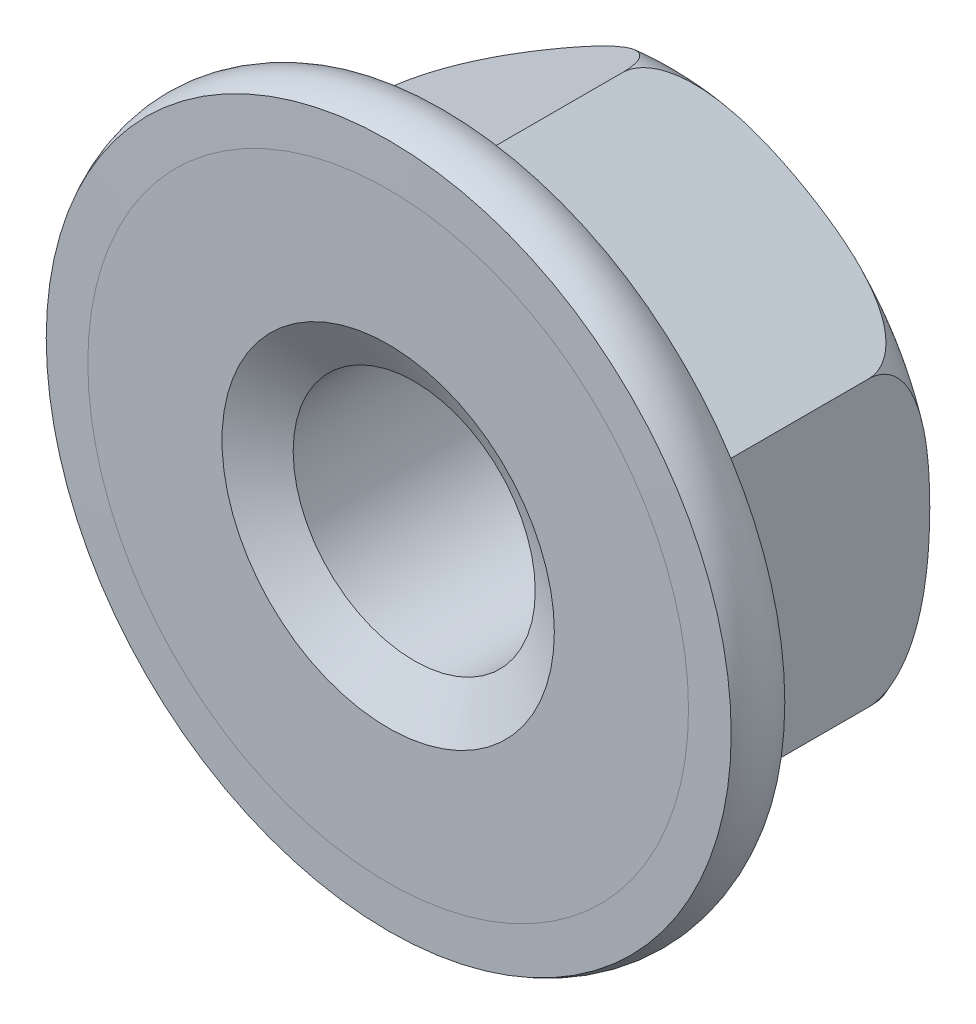
ISO-10303-21;
HEADER;
FILE_DESCRIPTION(('STEP AP214'),'2;1');
FILE_NAME('part.step','',(''),(''),'','','');
FILE_SCHEMA(('AUTOMOTIVE_DESIGN { 1 0 10303 214 1 1 1 1 }'));
ENDSEC;
DATA;
#1=APPLICATION_CONTEXT('core data for automotive mechanical design processes');
#2=APPLICATION_PROTOCOL_DEFINITION('international standard','automotive_design',2000,#1);
#3=PRODUCT_CONTEXT('',#1,'mechanical');
#4=PRODUCT('Part','Part','',(#3));
#5=PRODUCT_RELATED_PRODUCT_CATEGORY('part','',(#4));
#6=PRODUCT_DEFINITION_FORMATION('','',#4);
#7=PRODUCT_DEFINITION_CONTEXT('part definition',#1,'design');
#8=PRODUCT_DEFINITION('design','',#6,#7);
#9=PRODUCT_DEFINITION_SHAPE('','',#8);
#10=(LENGTH_UNIT() NAMED_UNIT(*) SI_UNIT(.MILLI.,.METRE.));
#11=(NAMED_UNIT(*) PLANE_ANGLE_UNIT() SI_UNIT($,.RADIAN.));
#12=(NAMED_UNIT(*) SI_UNIT($,.STERADIAN.) SOLID_ANGLE_UNIT());
#13=UNCERTAINTY_MEASURE_WITH_UNIT(LENGTH_MEASURE(1.E-05),#10,'distance_accuracy_value','');
#14=(GEOMETRIC_REPRESENTATION_CONTEXT(3) GLOBAL_UNCERTAINTY_ASSIGNED_CONTEXT((#13)) GLOBAL_UNIT_ASSIGNED_CONTEXT((#10,
#11,#12)) REPRESENTATION_CONTEXT('',''));
#15=CARTESIAN_POINT('',(0.,0.,0.));
#16=DIRECTION('',(0.,0.,1.));
#17=DIRECTION('',(1.,0.,0.));
#18=AXIS2_PLACEMENT_3D('',#15,#16,#17);
#19=CARTESIAN_POINT('',(0.,0.,-6.));
#20=DIRECTION('',(0.,0.,-1.));
#21=DIRECTION('',(-1.,0.,0.));
#22=AXIS2_PLACEMENT_3D('',#19,#20,#21);
#23=CONICAL_SURFACE('',#22,3.,1.0471975511966);
#24=CARTESIAN_POINT('',(0.,0.,-5.68736482923382));
#25=DIRECTION('',(0.,0.,1.));
#26=DIRECTION('',(1.,0.,0.));
#27=AXIS2_PLACEMENT_3D('',#24,#25,#26);
#28=CIRCLE('',#27,2.4585);
#29=CARTESIAN_POINT('',(2.4585,0.,-5.68736482923382));
#30=VERTEX_POINT('',#29);
#31=EDGE_CURVE('E29',#30,#30,#28,.T.);
#32=ORIENTED_EDGE('',*,*,#31,.T.);
#33=EDGE_LOOP('',(#32));
#34=FACE_BOUND('',#33,.T.);
#35=CARTESIAN_POINT('',(0.,0.,-6.));
#36=DIRECTION('',(0.,0.,1.));
#37=DIRECTION('',(1.,0.,0.));
#38=AXIS2_PLACEMENT_3D('',#35,#36,#37);
#39=CIRCLE('',#38,3.);
#40=CARTESIAN_POINT('',(3.,0.,-6.));
#41=VERTEX_POINT('',#40);
#42=EDGE_CURVE('E10',#41,#41,#39,.T.);
#43=ORIENTED_EDGE('',*,*,#42,.F.);
#44=EDGE_LOOP('',(#43));
#45=FACE_BOUND('',#44,.T.);
#46=ADVANCED_FACE('F16',(#34,#45),#23,.F.);
#47=CARTESIAN_POINT('',(0.,0.,-6.));
#48=DIRECTION('',(0.,0.,-1.));
#49=DIRECTION('',(0.,-1.,0.));
#50=AXIS2_PLACEMENT_3D('',#47,#48,#49);
#51=PLANE('',#50);
#52=ORIENTED_EDGE('',*,*,#42,.T.);
#53=EDGE_LOOP('',(#52));
#54=FACE_BOUND('',#53,.T.);
#55=CARTESIAN_POINT('',(0.,0.,-6.));
#56=DIRECTION('',(0.,0.,-1.));
#57=DIRECTION('',(-1.,0.,0.));
#58=AXIS2_PLACEMENT_3D('',#55,#56,#57);
#59=CIRCLE('',#58,5.);
#60=CARTESIAN_POINT('',(-2.5,-4.3301270189222,-6.));
#61=VERTEX_POINT('',#60);
#62=CARTESIAN_POINT('',(-5.,0.,-6.));
#63=VERTEX_POINT('',#62);
#64=EDGE_CURVE('E503',#61,#63,#59,.T.);
#65=ORIENTED_EDGE('',*,*,#64,.T.);
#66=CARTESIAN_POINT('',(0.,0.,-6.));
#67=DIRECTION('',(0.,0.,-1.));
#68=DIRECTION('',(-1.,0.,0.));
#69=AXIS2_PLACEMENT_3D('',#66,#67,#68);
#70=CIRCLE('',#69,5.);
#71=CARTESIAN_POINT('',(-2.5,4.3301270189222,-6.));
#72=VERTEX_POINT('',#71);
#73=EDGE_CURVE('E529',#63,#72,#70,.T.);
#74=ORIENTED_EDGE('',*,*,#73,.T.);
#75=CARTESIAN_POINT('',(0.,0.,-6.));
#76=DIRECTION('',(0.,0.,-1.));
#77=DIRECTION('',(-1.,0.,0.));
#78=AXIS2_PLACEMENT_3D('',#75,#76,#77);
#79=CIRCLE('',#78,5.);
#80=CARTESIAN_POINT('',(2.5,4.3301270189222,-6.));
#81=VERTEX_POINT('',#80);
#82=EDGE_CURVE('E162',#72,#81,#79,.T.);
#83=ORIENTED_EDGE('',*,*,#82,.T.);
#84=CARTESIAN_POINT('',(0.,0.,-6.));
#85=DIRECTION('',(0.,0.,1.));
#86=DIRECTION('',(1.,0.,0.));
#87=AXIS2_PLACEMENT_3D('',#84,#85,#86);
#88=CIRCLE('',#87,5.);
#89=CARTESIAN_POINT('',(5.,0.,-6.));
#90=VERTEX_POINT('',#89);
#91=EDGE_CURVE('E237',#90,#81,#88,.T.);
#92=ORIENTED_EDGE('',*,*,#91,.F.);
#93=CARTESIAN_POINT('',(0.,0.,-6.));
#94=DIRECTION('',(0.,0.,-1.));
#95=DIRECTION('',(-1.,0.,0.));
#96=AXIS2_PLACEMENT_3D('',#93,#94,#95);
#97=CIRCLE('',#96,5.);
#98=CARTESIAN_POINT('',(2.5,-4.3301270189222,-6.));
#99=VERTEX_POINT('',#98);
#100=EDGE_CURVE('E320',#90,#99,#97,.T.);
#101=ORIENTED_EDGE('',*,*,#100,.T.);
#102=CARTESIAN_POINT('',(0.,0.,-6.));
#103=DIRECTION('',(0.,0.,-1.));
#104=DIRECTION('',(-1.,0.,0.));
#105=AXIS2_PLACEMENT_3D('',#102,#103,#104);
#106=CIRCLE('',#105,5.);
#107=EDGE_CURVE('E328',#99,#61,#106,.T.);
#108=ORIENTED_EDGE('',*,*,#107,.T.);
#109=EDGE_LOOP('',(#65,#74,#83,#92,#101,#108));
#110=FACE_BOUND('',#109,.T.);
#111=ADVANCED_FACE('F270',(#54,#110),#51,.T.);
#112=CARTESIAN_POINT('',(0.,0.,-21.2752523165195));
#113=DIRECTION('',(0.,0.,1.));
#114=DIRECTION('',(1.,0.,0.));
#115=AXIS2_PLACEMENT_3D('',#112,#113,#114);
#116=CYLINDRICAL_SURFACE('',#115,2.4585);
#117=ORIENTED_EDGE('',*,*,#31,.F.);
#118=EDGE_LOOP('',(#117));
#119=FACE_BOUND('',#118,.T.);
#120=CARTESIAN_POINT('',(0.,0.,-0.529141521712289));
#121=DIRECTION('',(0.,0.,1.));
#122=DIRECTION('',(1.,0.,0.));
#123=AXIS2_PLACEMENT_3D('',#120,#121,#122);
#124=CIRCLE('',#123,2.4585);
#125=CARTESIAN_POINT('',(2.4585,0.,-0.529141521712289));
#126=VERTEX_POINT('',#125);
#127=EDGE_CURVE('E96',#126,#126,#124,.T.);
#128=ORIENTED_EDGE('',*,*,#127,.T.);
#129=EDGE_LOOP('',(#128));
#130=FACE_BOUND('',#129,.T.);
#131=ADVANCED_FACE('F18',(#119,#130),#116,.F.);
#132=CARTESIAN_POINT('',(0.,0.,-0.529141521712289));
#133=DIRECTION('',(0.,0.,1.));
#134=DIRECTION('',(1.,0.,0.));
#135=AXIS2_PLACEMENT_3D('',#132,#133,#134);
#136=CONICAL_SURFACE('',#135,2.4585,1.0471975511966);
#137=ORIENTED_EDGE('',*,*,#127,.F.);
#138=EDGE_LOOP('',(#137));
#139=FACE_BOUND('',#138,.T.);
#140=CARTESIAN_POINT('',(0.,0.,0.));
#141=DIRECTION('',(0.,0.,1.));
#142=DIRECTION('',(1.,0.,0.));
#143=AXIS2_PLACEMENT_3D('',#140,#141,#142);
#144=CIRCLE('',#143,3.375);
#145=CARTESIAN_POINT('',(3.375,0.,0.));
#146=VERTEX_POINT('',#145);
#147=EDGE_CURVE('E145',#146,#146,#144,.T.);
#148=ORIENTED_EDGE('',*,*,#147,.T.);
#149=EDGE_LOOP('',(#148));
#150=FACE_BOUND('',#149,.T.);
#151=ADVANCED_FACE('F272',(#139,#150),#136,.F.);
#152=CARTESIAN_POINT('',(0.,0.,-4.75133305687565));
#153=DIRECTION('',(0.,0.,1.));
#154=DIRECTION('',(1.,0.,0.));
#155=AXIS2_PLACEMENT_3D('',#152,#153,#154);
#156=TOROIDAL_SURFACE('',#155,4.37888857366147,1.39461411823479);
#157=CARTESIAN_POINT('',(-2.5,4.3301270189222,-6.));
#158=CARTESIAN_POINT('',(-2.88964553372614,4.10516506513687,-6.));
#159=CARTESIAN_POINT('',(-3.23576250676072,3.90533433758426,-5.9617082365837));
#160=CARTESIAN_POINT('',(-3.64618786915515,3.66837514412359,-5.91630187948115));
#161=CARTESIAN_POINT('',(-3.9627189805398,3.48562582175876,-5.8177865064615));
#162=CARTESIAN_POINT('',(-4.37730977633334,3.24626171420383,-5.68875158563035));
#163=CARTESIAN_POINT('',(-4.63663296139892,3.0965414034991,-5.46751192970725));
#164=CARTESIAN_POINT('',(-4.80027369550224,3.00206338161416,-5.327903048616));
#165=CARTESIAN_POINT('',(-4.89292934853026,2.94856861539649,-5.1586722561715));
#166=CARTESIAN_POINT('',(-5.,2.88675134594813,-4.96311320927455));
#167=CARTESIAN_POINT('',(-5.,2.88675134594813,-4.7513330568756));
#168=B_SPLINE_CURVE_WITH_KNOTS('',2,(#157,#158,#159,#160,#161,#162,#163,#164,#165,#166,#167),
.UNSPECIFIED.,.F.,.F.,(3,2,2,2,2,3),(0.,0.25,0.5,0.75,0.875,1.),.UNSPECIFIED.);
#169=CARTESIAN_POINT('',(-5.,2.88675134594813,-4.75133305687565));
#170=VERTEX_POINT('',#169);
#171=EDGE_CURVE('E167',#72,#170,#168,.T.);
#172=ORIENTED_EDGE('',*,*,#171,.F.);
#173=ORIENTED_EDGE('',*,*,#73,.F.);
#174=CARTESIAN_POINT('',(-5.,2.88675134594813,-4.7513330568756));
#175=CARTESIAN_POINT('',(-5.,2.88675134594813,-4.8559158679137));
#176=CARTESIAN_POINT('',(-5.,2.85366671302089,-4.9629522256256));
#177=CARTESIAN_POINT('',(-5.,2.82210761508905,-5.06505312856525));
#178=CARTESIAN_POINT('',(-5.,2.76326389422642,-5.1584392256699));
#179=CARTESIAN_POINT('',(-5.,2.6572799870142,-5.3266376894202));
#180=CARTESIAN_POINT('',(-5.,2.46803862567536,-5.46687011690105));
#181=CARTESIAN_POINT('',(-5.,2.17086833239834,-5.687080494308));
#182=CARTESIAN_POINT('',(-5.,1.69361066819731,-5.8165404447657));
#183=CARTESIAN_POINT('',(-5.,1.32868051568493,-5.9155306611803));
#184=CARTESIAN_POINT('',(-5.,0.85269765542909,-5.9614091477326));
#185=CARTESIAN_POINT('',(-5.,0.452322978270045,-6.));
#186=CARTESIAN_POINT('',(-5.,0.,-6.));
#187=B_SPLINE_CURVE_WITH_KNOTS('',2,(#174,#175,#176,#177,#178,#179,#180,#181,#182,#183,#184,
#185,#186),.UNSPECIFIED.,.F.,.F.,(3,2,2,2,2,2,3),(0.,0.0625,0.125,0.25,0.5,0.75,1.),.UNSPECIFIED.);
#188=EDGE_CURVE('E484',#170,#63,#187,.T.);
#189=ORIENTED_EDGE('',*,*,#188,.F.);
#190=EDGE_LOOP('',(#172,#173,#189));
#191=FACE_BOUND('',#190,.T.);
#192=ADVANCED_FACE('F608',(#191),#156,.T.);
#193=CARTESIAN_POINT('',(0.,0.,-4.75133305687565));
#194=DIRECTION('',(0.,0.,1.));
#195=DIRECTION('',(1.,0.,0.));
#196=AXIS2_PLACEMENT_3D('',#193,#194,#195);
#197=TOROIDAL_SURFACE('',#196,4.37888857366147,1.39461411823479);
#198=ORIENTED_EDGE('',*,*,#82,.F.);
#199=CARTESIAN_POINT('',(0.,5.77350269189626,-4.7513330568756));
#200=CARTESIAN_POINT('',(0.,5.77350269189626,-4.96293395911315));
#201=CARTESIAN_POINT('',(-0.107398510776136,5.71149613278909,-5.15927132721295));
#202=CARTESIAN_POINT('',(-0.199672393323843,5.658221781861,-5.32795905959255));
#203=CARTESIAN_POINT('',(-0.364459707067599,5.56308178191201,-5.46844378948785));
#204=CARTESIAN_POINT('',(-0.623207513892198,5.4136936659896,-5.68903186102635));
#205=CARTESIAN_POINT('',(-1.03884643124853,5.17372442516824,-5.8182734851368));
#206=CARTESIAN_POINT('',(-1.35355839480385,4.99202538829238,-5.91613218796375));
#207=CARTESIAN_POINT('',(-1.76324165072584,4.75549465020333,-5.9615978907727));
#208=CARTESIAN_POINT('',(-2.10927613761383,4.55571154604966,-6.));
#209=CARTESIAN_POINT('',(-2.5,4.3301270189222,-6.));
#210=B_SPLINE_CURVE_WITH_KNOTS('',2,(#199,#200,#201,#202,#203,#204,#205,#206,#207,#208,#209),
.UNSPECIFIED.,.F.,.F.,(3,2,2,2,2,3),(0.,0.125,0.25,0.5,0.75,1.),.UNSPECIFIED.);
#211=CARTESIAN_POINT('',(0.,5.77350269189626,-4.75133305687565));
#212=VERTEX_POINT('',#211);
#213=EDGE_CURVE('E154',#212,#72,#210,.T.);
#214=ORIENTED_EDGE('',*,*,#213,.F.);
#215=CARTESIAN_POINT('',(2.5,4.3301270189222,-6.));
#216=CARTESIAN_POINT('',(2.11035446627982,4.55508897270408,-6.));
#217=CARTESIAN_POINT('',(1.76423749323927,4.75491970026014,-5.9617082365837));
#218=CARTESIAN_POINT('',(1.35381213083918,4.99187889372408,-5.91630187948135));
#219=CARTESIAN_POINT('',(1.0372810194602,5.17462821608563,-5.8177865064615));
#220=CARTESIAN_POINT('',(0.622690223662821,5.41399232364279,-5.68875158562665));
#221=CARTESIAN_POINT('',(0.363367038601075,5.5637126343453,-5.46751192970725));
#222=CARTESIAN_POINT('',(0.199726304498179,5.65819065622999,-5.32790304861665));
#223=CARTESIAN_POINT('',(0.10707065146974,5.7116854224479,-5.1586722561715));
#224=CARTESIAN_POINT('',(0.,5.77350269189627,-4.9631132092747));
#225=CARTESIAN_POINT('',(0.,5.77350269189627,-4.7513330568756));
#226=B_SPLINE_CURVE_WITH_KNOTS('',2,(#215,#216,#217,#218,#219,#220,#221,#222,#223,#224,#225),
.UNSPECIFIED.,.F.,.F.,(3,2,2,2,2,3),(0.,0.25,0.5,0.75,0.875,1.),.UNSPECIFIED.);
#227=EDGE_CURVE('E159',#81,#212,#226,.T.);
#228=ORIENTED_EDGE('',*,*,#227,.F.);
#229=EDGE_LOOP('',(#198,#214,#228));
#230=FACE_BOUND('',#229,.T.);
#231=ADVANCED_FACE('F157',(#230),#197,.T.);
#232=CARTESIAN_POINT('',(0.,0.,-4.75133305687565));
#233=DIRECTION('',(0.,0.,1.));
#234=DIRECTION('',(1.,0.,0.));
#235=AXIS2_PLACEMENT_3D('',#232,#233,#234);
#236=TOROIDAL_SURFACE('',#235,4.37888857366147,1.39461411823479);
#237=ORIENTED_EDGE('',*,*,#91,.T.);
#238=CARTESIAN_POINT('',(5.,2.88675134594813,-4.7513330568756));
#239=CARTESIAN_POINT('',(5.,2.88675134594813,-4.9629339591118));
#240=CARTESIAN_POINT('',(4.89260148922386,2.9487579050553,-5.15927132721295));
#241=CARTESIAN_POINT('',(4.80032760667719,3.0020322559828,-5.3279590595918));
#242=CARTESIAN_POINT('',(4.6355402929324,3.09717225593239,-5.46844378948785));
#243=CARTESIAN_POINT('',(4.37679248610757,3.24656037185493,-5.68903186102635));
#244=CARTESIAN_POINT('',(3.96115356875147,3.48652961267616,-5.8182734851368));
#245=CARTESIAN_POINT('',(3.64644160520842,3.66822864954493,-5.91613218796));
#246=CARTESIAN_POINT('',(3.23675834927416,3.90475938764106,-5.9615978907727));
#247=CARTESIAN_POINT('',(2.89072386240442,4.1045424917842,-6.));
#248=CARTESIAN_POINT('',(2.5,4.3301270189222,-6.));
#249=B_SPLINE_CURVE_WITH_KNOTS('',2,(#238,#239,#240,#241,#242,#243,#244,#245,#246,#247,#248),
.UNSPECIFIED.,.F.,.F.,(3,2,2,2,2,3),(0.,0.125,0.25,0.5,0.75,1.),.UNSPECIFIED.);
#250=CARTESIAN_POINT('',(5.,2.88675134594813,-4.75133305687565));
#251=VERTEX_POINT('',#250);
#252=EDGE_CURVE('E187',#251,#81,#249,.T.);
#253=ORIENTED_EDGE('',*,*,#252,.F.);
#254=CARTESIAN_POINT('',(5.,0.,-6.));
#255=CARTESIAN_POINT('',(5.,1.01730948736007,-6.));
#256=CARTESIAN_POINT('',(5.,1.6946038712607,-5.8162710270555));
#257=CARTESIAN_POINT('',(5.,2.17138637002211,-5.6869347134856));
#258=CARTESIAN_POINT('',(5.,2.46946500612235,-5.4658125955546));
#259=CARTESIAN_POINT('',(5.,2.65789417083632,-5.32603117234815));
#260=CARTESIAN_POINT('',(5.,2.76431756525186,-5.1567653319791));
#261=CARTESIAN_POINT('',(5.,2.88675134594813,-4.9620350577482));
#262=CARTESIAN_POINT('',(5.,2.88675134594813,-4.7513330568756));
#263=B_SPLINE_CURVE_WITH_KNOTS('',2,(#254,#255,#256,#257,#258,#259,#260,#261,#262),
.UNSPECIFIED.,.F.,.F.,(3,2,2,2,3),(0.,0.5,0.75,0.875,1.),.UNSPECIFIED.);
#264=EDGE_CURVE('E234',#90,#251,#263,.T.);
#265=ORIENTED_EDGE('',*,*,#264,.F.);
#266=EDGE_LOOP('',(#237,#253,#265));
#267=FACE_BOUND('',#266,.T.);
#268=ADVANCED_FACE('F232',(#267),#236,.T.);
#269=CARTESIAN_POINT('',(0.,0.,-4.75133305687565));
#270=DIRECTION('',(0.,0.,1.));
#271=DIRECTION('',(1.,0.,0.));
#272=AXIS2_PLACEMENT_3D('',#269,#270,#271);
#273=TOROIDAL_SURFACE('',#272,4.37888857366147,1.39461411823479);
#274=CARTESIAN_POINT('',(2.5,-4.3301270189222,-6.));
#275=CARTESIAN_POINT('',(2.88964553371433,-4.10516506514369,-6.));
#276=CARTESIAN_POINT('',(3.23576250676073,-3.90533433758426,-5.9617082365837));
#277=CARTESIAN_POINT('',(3.64618786915129,-3.66837514412581,-5.91630187948315));
#278=CARTESIAN_POINT('',(3.96271898053981,-3.48562582175876,-5.8177865064615));
#279=CARTESIAN_POINT('',(4.37730977633705,-3.24626171420168,-5.6887515856282));
#280=CARTESIAN_POINT('',(4.63663296139893,-3.0965414034991,-5.46751192970725));
#281=CARTESIAN_POINT('',(4.8002736955025,-3.00206338161401,-5.32790304861515));
#282=CARTESIAN_POINT('',(4.89292934853026,-2.94856861539649,-5.1586722561715));
#283=CARTESIAN_POINT('',(5.,-2.88675134594813,-4.963113209275));
#284=CARTESIAN_POINT('',(5.,-2.88675134594813,-4.7513330568756));
#285=B_SPLINE_CURVE_WITH_KNOTS('',2,(#274,#275,#276,#277,#278,#279,#280,#281,#282,#283,#284),
.UNSPECIFIED.,.F.,.F.,(3,2,2,2,2,3),(0.,0.25,0.5,0.75,0.875,1.),.UNSPECIFIED.);
#286=CARTESIAN_POINT('',(5.,-2.88675134594813,-4.75133305687565));
#287=VERTEX_POINT('',#286);
#288=EDGE_CURVE('E422',#99,#287,#285,.T.);
#289=ORIENTED_EDGE('',*,*,#288,.F.);
#290=ORIENTED_EDGE('',*,*,#100,.F.);
#291=CARTESIAN_POINT('',(5.,-2.88675134594813,-4.7513330568756));
#292=CARTESIAN_POINT('',(5.,-2.88675134594813,-4.85591586791435));
#293=CARTESIAN_POINT('',(5.,-2.85366671302089,-4.9629522256256));
#294=CARTESIAN_POINT('',(5.,-2.82210761508875,-5.0650531285656));
#295=CARTESIAN_POINT('',(5.,-2.76326389422642,-5.1584392256699));
#296=CARTESIAN_POINT('',(5.,-2.65727998701662,-5.32663768941665));
#297=CARTESIAN_POINT('',(5.,-2.46803862567536,-5.46687011690105));
#298=CARTESIAN_POINT('',(5.,-2.17086833240434,-5.6870804943064));
#299=CARTESIAN_POINT('',(5.,-1.69361066819732,-5.8165404447657));
#300=CARTESIAN_POINT('',(5.,-1.32868051568035,-5.9155306611815));
#301=CARTESIAN_POINT('',(5.,-0.85269765542909,-5.9614091477326));
#302=CARTESIAN_POINT('',(5.,-0.452322978263085,-6.));
#303=CARTESIAN_POINT('',(5.,0.,-6.));
#304=B_SPLINE_CURVE_WITH_KNOTS('',2,(#291,#292,#293,#294,#295,#296,#297,#298,#299,#300,#301,
#302,#303),.UNSPECIFIED.,.F.,.F.,(3,2,2,2,2,2,3),(0.,0.0625,0.125,0.25,0.5,0.75,1.),.UNSPECIFIED.);
#305=EDGE_CURVE('E296',#287,#90,#304,.T.);
#306=ORIENTED_EDGE('',*,*,#305,.F.);
#307=EDGE_LOOP('',(#289,#290,#306));
#308=FACE_BOUND('',#307,.T.);
#309=ADVANCED_FACE('F300',(#308),#273,.T.);
#310=CARTESIAN_POINT('',(0.,0.,-4.75133305687565));
#311=DIRECTION('',(0.,0.,1.));
#312=DIRECTION('',(1.,0.,0.));
#313=AXIS2_PLACEMENT_3D('',#310,#311,#312);
#314=TOROIDAL_SURFACE('',#313,4.37888857366147,1.39461411823479);
#315=CARTESIAN_POINT('',(-2.5,-4.3301270189222,-5.99999999999999));
#316=CARTESIAN_POINT('',(-2.11035446627372,-4.5550889727076,-5.99999999999999));
#317=CARTESIAN_POINT('',(-1.76423749323928,-4.75491970026013,-5.96170823658369));
#318=CARTESIAN_POINT('',(-1.35381213083783,-4.99187889372485,-5.91630187948039));
#319=CARTESIAN_POINT('',(-1.0372810194602,-5.17462821608563,-5.81778650646149));
#320=CARTESIAN_POINT('',(-0.622690223663289,-5.41399232364251,-5.68875158562749));
#321=CARTESIAN_POINT('',(-0.363367038601075,-5.56371263434529,-5.46751192970724));
#322=CARTESIAN_POINT('',(-0.199726304497486,-5.65819065623038,-5.32790304861575));
#323=CARTESIAN_POINT('',(-0.10707065146974,-5.7116854224479,-5.15867225617149));
#324=CARTESIAN_POINT('',(0.,-5.77350269189625,-4.96311320927424));
#325=CARTESIAN_POINT('',(0.,-5.77350269189625,-4.75133305687559));
#326=B_SPLINE_CURVE_WITH_KNOTS('',2,(#315,#316,#317,#318,#319,#320,#321,#322,#323,#324,#325),
.UNSPECIFIED.,.F.,.F.,(3,2,2,2,2,3),(0.,0.25,0.5,0.75,0.875,1.),.UNSPECIFIED.);
#327=CARTESIAN_POINT('',(0.,-5.77350269189626,-4.75133305687565));
#328=VERTEX_POINT('',#327);
#329=EDGE_CURVE('E408',#61,#328,#326,.T.);
#330=ORIENTED_EDGE('',*,*,#329,.F.);
#331=ORIENTED_EDGE('',*,*,#107,.F.);
#332=CARTESIAN_POINT('',(0.,-5.77350269189626,-4.7513330568756));
#333=CARTESIAN_POINT('',(0.,-5.77350269189626,-4.9629339591138));
#334=CARTESIAN_POINT('',(0.107398510776138,-5.71149613278909,-5.15927132721295));
#335=CARTESIAN_POINT('',(0.19967239332514,-5.65822178186025,-5.32795905959435));
#336=CARTESIAN_POINT('',(0.364459707067601,-5.56308178191201,-5.46844378948785));
#337=CARTESIAN_POINT('',(0.623207513898577,-5.41369366598592,-5.6890318610307));
#338=CARTESIAN_POINT('',(1.03884643124854,-5.17372442516824,-5.8182734851368));
#339=CARTESIAN_POINT('',(1.35355839481281,-4.9920253882872,-5.91613218796475));
#340=CARTESIAN_POINT('',(1.76324165072584,-4.75549465020333,-5.9615978907727));
#341=CARTESIAN_POINT('',(2.10927613761385,-4.55571154604965,-6.));
#342=CARTESIAN_POINT('',(2.5,-4.3301270189222,-6.));
#343=B_SPLINE_CURVE_WITH_KNOTS('',2,(#332,#333,#334,#335,#336,#337,#338,#339,#340,#341,#342),
.UNSPECIFIED.,.F.,.F.,(3,2,2,2,2,3),(0.,0.125,0.25,0.5,0.75,1.),.UNSPECIFIED.);
#344=EDGE_CURVE('E336',#328,#99,#343,.T.);
#345=ORIENTED_EDGE('',*,*,#344,.F.);
#346=EDGE_LOOP('',(#330,#331,#345));
#347=FACE_BOUND('',#346,.T.);
#348=ADVANCED_FACE('F212',(#347),#314,.T.);
#349=CARTESIAN_POINT('',(0.,0.,-4.75133305687565));
#350=DIRECTION('',(0.,0.,1.));
#351=DIRECTION('',(1.,0.,0.));
#352=AXIS2_PLACEMENT_3D('',#349,#350,#351);
#353=TOROIDAL_SURFACE('',#352,4.37888857366147,1.39461411823479);
#354=CARTESIAN_POINT('',(-5.,0.,-6.));
#355=CARTESIAN_POINT('',(-5.,-1.01730948736471,-6.));
#356=CARTESIAN_POINT('',(-5.,-1.6946038712607,-5.8162710270555));
#357=CARTESIAN_POINT('',(-5.,-2.17138637001734,-5.686934713486));
#358=CARTESIAN_POINT('',(-5.,-2.46946500612235,-5.4658125955546));
#359=CARTESIAN_POINT('',(-5.,-2.65789417083351,-5.32603117235225));
#360=CARTESIAN_POINT('',(-5.,-2.76431756525186,-5.1567653319791));
#361=CARTESIAN_POINT('',(-5.,-2.88675134594813,-4.96203505774865));
#362=CARTESIAN_POINT('',(-5.,-2.88675134594813,-4.7513330568756));
#363=B_SPLINE_CURVE_WITH_KNOTS('',2,(#354,#355,#356,#357,#358,#359,#360,#361,#362),
.UNSPECIFIED.,.F.,.F.,(3,2,2,2,3),(0.,0.5,0.75,0.875,1.),.UNSPECIFIED.);
#364=CARTESIAN_POINT('',(-5.,-2.88675134594813,-4.75133305687565));
#365=VERTEX_POINT('',#364);
#366=EDGE_CURVE('E476',#63,#365,#363,.T.);
#367=ORIENTED_EDGE('',*,*,#366,.F.);
#368=ORIENTED_EDGE('',*,*,#64,.F.);
#369=CARTESIAN_POINT('',(-5.,-2.88675134594813,-4.75133305687559));
#370=CARTESIAN_POINT('',(-5.,-2.88675134594813,-4.96293395911344));
#371=CARTESIAN_POINT('',(-4.89260148922386,-2.9487579050553,-5.15927132721294));
#372=CARTESIAN_POINT('',(-4.80032760667629,-3.00203225598331,-5.32795905959199));
#373=CARTESIAN_POINT('',(-4.6355402929324,-3.09717225593238,-5.46844378948784));
#374=CARTESIAN_POINT('',(-4.37679248610597,-3.24656037185584,-5.68903186102859));
#375=CARTESIAN_POINT('',(-3.96115356875147,-3.48652961267615,-5.81827348513679));
#376=CARTESIAN_POINT('',(-3.64644160519006,-3.66822864955553,-5.91613218796439));
#377=CARTESIAN_POINT('',(-3.23675834927416,-3.90475938764105,-5.96159789077269));
#378=CARTESIAN_POINT('',(-2.89072386238646,-4.10454249179456,-5.99999999999999));
#379=CARTESIAN_POINT('',(-2.5,-4.3301270189222,-5.99999999999999));
#380=B_SPLINE_CURVE_WITH_KNOTS('',2,(#369,#370,#371,#372,#373,#374,#375,#376,#377,#378,#379),
.UNSPECIFIED.,.F.,.F.,(3,2,2,2,2,3),(0.,0.125,0.25,0.5,0.75,1.),.UNSPECIFIED.);
#381=EDGE_CURVE('E414',#365,#61,#380,.T.);
#382=ORIENTED_EDGE('',*,*,#381,.F.);
#383=EDGE_LOOP('',(#367,#368,#382));
#384=FACE_BOUND('',#383,.T.);
#385=ADVANCED_FACE('F595',(#384),#353,.T.);
#386=CARTESIAN_POINT('',(0.,0.,-2.01202328571037));
#387=DIRECTION('',(0.,0.,1.));
#388=DIRECTION('',(1.,0.,0.));
#389=AXIS2_PLACEMENT_3D('',#386,#387,#388);
#390=CONICAL_SURFACE('',#389,5.,1.13446401379632);
#391=CARTESIAN_POINT('',(0.,5.77350269189627,-1.6513330568756));
#392=CARTESIAN_POINT('',(1.33355169157005,5.00357626379001,-2.0103556465175));
#393=CARTESIAN_POINT('',(2.48897781588958,4.33649067988541,-2.0120157322509));
#394=CARTESIAN_POINT('',(3.65406432531485,3.66382767003953,-2.0136896977704));
#395=CARTESIAN_POINT('',(5.,2.88675134594813,-1.6513330568756));
#396=B_SPLINE_CURVE_WITH_KNOTS('',2,(#391,#392,#393,#394,#395),.UNSPECIFIED.,.F.,.F.,(3,2,3),
(0.,0.5,1.),.UNSPECIFIED.);
#397=CARTESIAN_POINT('',(0.,5.77350269189626,-1.65133305687565));
#398=VERTEX_POINT('',#397);
#399=CARTESIAN_POINT('',(5.,2.88675134594813,-1.65133305687565));
#400=VERTEX_POINT('',#399);
#401=EDGE_CURVE('E181',#398,#400,#396,.T.);
#402=ORIENTED_EDGE('',*,*,#401,.F.);
#403=CARTESIAN_POINT('',(-5.,2.88675134594813,-1.6513330568756));
#404=CARTESIAN_POINT('',(-3.66644830841523,3.65667777406288,-2.01035564652145));
#405=CARTESIAN_POINT('',(-2.51102218411042,4.32376335795899,-2.0120157322509));
#406=CARTESIAN_POINT('',(-1.34593567467044,4.99642636781336,-2.01368969776645));
#407=CARTESIAN_POINT('',(0.,5.77350269189626,-1.6513330568756));
#408=B_SPLINE_CURVE_WITH_KNOTS('',2,(#403,#404,#405,#406,#407),.UNSPECIFIED.,.F.,.F.,(3,2,3),
(0.,0.5,1.),.UNSPECIFIED.);
#409=CARTESIAN_POINT('',(-5.,2.88675134594813,-1.65133305687565));
#410=VERTEX_POINT('',#409);
#411=EDGE_CURVE('E175',#410,#398,#408,.T.);
#412=ORIENTED_EDGE('',*,*,#411,.F.);
#413=CARTESIAN_POINT('',(-5.,-2.88675134594828,-1.65133305687575));
#414=CARTESIAN_POINT('',(-5.,-2.13040054729662,-1.82767914170695));
#415=CARTESIAN_POINT('',(-5.,-1.44790325418871,-1.9162331815438));
#416=CARTESIAN_POINT('',(-5.,-0.710449649059585,-2.01191780415825));
#417=CARTESIAN_POINT('',(-5.,-0.00104291932583045,-2.01202323499095));
#418=CARTESIAN_POINT('',(-5.,0.70929972176098,-2.01212880491725));
#419=CARTESIAN_POINT('',(-5.,1.45001382105242,-1.91595924679405));
#420=CARTESIAN_POINT('',(-5.,2.13095159742586,-1.8275506622594));
#421=CARTESIAN_POINT('',(-5.,2.88675134594813,-1.6513330568756));
#422=B_SPLINE_CURVE_WITH_KNOTS('',2,(#413,#414,#415,#416,#417,#418,#419,#420,#421),
.UNSPECIFIED.,.F.,.F.,(3,2,2,2,3),(0.,0.25,0.5,0.75,1.),.UNSPECIFIED.);
#423=CARTESIAN_POINT('',(-5.,-2.88675134594828,-1.65133305687578));
#424=VERTEX_POINT('',#423);
#425=EDGE_CURVE('E468',#424,#410,#422,.T.);
#426=ORIENTED_EDGE('',*,*,#425,.F.);
#427=CARTESIAN_POINT('',(0.,-5.77350269189626,-1.65133305687559));
#428=CARTESIAN_POINT('',(-1.33355169157007,-5.00357626378999,-2.01035564651749));
#429=CARTESIAN_POINT('',(-2.48897781588954,-4.33649067988543,-2.01201573225089));
#430=CARTESIAN_POINT('',(-3.65406432531382,-3.66382767004012,-2.01368969777039));
#431=CARTESIAN_POINT('',(-4.99999999999994,-2.88675134594817,-1.65133305687574));
#432=B_SPLINE_CURVE_WITH_KNOTS('',2,(#427,#428,#429,#430,#431),.UNSPECIFIED.,.F.,.F.,(3,2,3),
(0.,0.5,1.),.UNSPECIFIED.);
#433=CARTESIAN_POINT('',(0.,-5.77350269189626,-1.65133305687565));
#434=VERTEX_POINT('',#433);
#435=EDGE_CURVE('E413',#434,#424,#432,.T.);
#436=ORIENTED_EDGE('',*,*,#435,.F.);
#437=CARTESIAN_POINT('',(5.00000000000001,-2.88675134594813,-1.6513330568756));
#438=CARTESIAN_POINT('',(3.66644830842995,-3.65667777405438,-2.0103556465175));
#439=CARTESIAN_POINT('',(2.51102218411042,-4.32376335795899,-2.0120157322509));
#440=CARTESIAN_POINT('',(1.34593567468516,-4.99642636780486,-2.0136896977704));
#441=CARTESIAN_POINT('',(0.,-5.77350269189626,-1.6513330568756));
#442=B_SPLINE_CURVE_WITH_KNOTS('',2,(#437,#438,#439,#440,#441),.UNSPECIFIED.,.F.,.F.,(3,2,3),
(0.,0.5,1.),.UNSPECIFIED.);
#443=CARTESIAN_POINT('',(5.,-2.88675134594813,-1.65133305687565));
#444=VERTEX_POINT('',#443);
#445=EDGE_CURVE('E720',#444,#434,#442,.T.);
#446=ORIENTED_EDGE('',*,*,#445,.F.);
#447=CARTESIAN_POINT('',(5.,2.88675134594813,-1.6513330568756));
#448=CARTESIAN_POINT('',(5.,2.1315507514658,-1.8274109672008));
#449=CARTESIAN_POINT('',(5.,1.45001382105258,-1.91595924679405));
#450=CARTESIAN_POINT('',(5.,0.710378904472675,-2.0120558726226));
#451=CARTESIAN_POINT('',(5.,-0.00104291932579489,-2.01202323499095));
#452=CARTESIAN_POINT('',(5.,-0.7093719235474,-2.01199073924745));
#453=CARTESIAN_POINT('',(5.,-1.44790325418868,-1.9162331815438));
#454=CARTESIAN_POINT('',(5.,-2.12980318177145,-1.8278184197666));
#455=CARTESIAN_POINT('',(5.,-2.88675134594813,-1.6513330568756));
#456=B_SPLINE_CURVE_WITH_KNOTS('',2,(#447,#448,#449,#450,#451,#452,#453,#454,#455),
.UNSPECIFIED.,.F.,.F.,(3,2,2,2,3),(0.,0.25,0.5,0.75,1.),.UNSPECIFIED.);
#457=EDGE_CURVE('E357',#400,#444,#456,.T.);
#458=ORIENTED_EDGE('',*,*,#457,.F.);
#459=EDGE_LOOP('',(#402,#412,#426,#436,#446,#458));
#460=FACE_BOUND('',#459,.T.);
#461=CARTESIAN_POINT('',(0.,0.,-1.1));
#462=DIRECTION('',(0.,0.,1.));
#463=DIRECTION('',(1.,0.,0.));
#464=AXIS2_PLACEMENT_3D('',#461,#462,#463);
#465=CIRCLE('',#464,6.95584024787179);
#466=CARTESIAN_POINT('',(6.95584024787179,0.,-1.1));
#467=VERTEX_POINT('',#466);
#468=EDGE_CURVE('E430',#467,#467,#465,.T.);
#469=ORIENTED_EDGE('',*,*,#468,.F.);
#470=EDGE_LOOP('',(#469));
#471=FACE_BOUND('',#470,.T.);
#472=ADVANCED_FACE('F309',(#460,#471),#390,.T.);
#473=CARTESIAN_POINT('',(0.,0.,-0.0112035625547047));
#474=DIRECTION('',(0.,0.,-1.));
#475=DIRECTION('',(-1.,0.,0.));
#476=AXIS2_PLACEMENT_3D('',#473,#474,#475);
#477=CONICAL_SURFACE('',#476,6.95584024787179,1.55770635740494);
#478=CARTESIAN_POINT('',(0.,0.,0.));
#479=DIRECTION('',(0.,0.,1.));
#480=DIRECTION('',(1.,0.,0.));
#481=AXIS2_PLACEMENT_3D('',#478,#479,#480);
#482=CIRCLE('',#481,6.1);
#483=CARTESIAN_POINT('',(6.1,0.,0.));
#484=VERTEX_POINT('',#483);
#485=EDGE_CURVE('E135',#484,#484,#482,.T.);
#486=ORIENTED_EDGE('',*,*,#485,.F.);
#487=EDGE_LOOP('',(#486));
#488=FACE_BOUND('',#487,.T.);
#489=CARTESIAN_POINT('',(0.,0.,-0.0112035625547047));
#490=DIRECTION('',(0.,0.,1.));
#491=DIRECTION('',(1.,0.,0.));
#492=AXIS2_PLACEMENT_3D('',#489,#490,#491);
#493=CIRCLE('',#492,6.95584024787179);
#494=CARTESIAN_POINT('',(6.95584024787179,0.,-0.0112035625547047));
#495=VERTEX_POINT('',#494);
#496=EDGE_CURVE('E106',#495,#495,#493,.T.);
#497=ORIENTED_EDGE('',*,*,#496,.T.);
#498=EDGE_LOOP('',(#497));
#499=FACE_BOUND('',#498,.T.);
#500=ADVANCED_FACE('F210',(#488,#499),#477,.T.);
#501=CARTESIAN_POINT('',(0.,0.,-0.555601781277353));
#502=DIRECTION('',(0.,0.,1.));
#503=DIRECTION('',(1.,0.,0.));
#504=AXIS2_PLACEMENT_3D('',#501,#502,#503);
#505=TOROIDAL_SURFACE('',#504,6.,1.1);
#506=ORIENTED_EDGE('',*,*,#496,.F.);
#507=EDGE_LOOP('',(#506));
#508=FACE_BOUND('',#507,.T.);
#509=ORIENTED_EDGE('',*,*,#468,.T.);
#510=EDGE_LOOP('',(#509));
#511=FACE_BOUND('',#510,.T.);
#512=ADVANCED_FACE('F576',(#508,#511),#505,.T.);
#513=CARTESIAN_POINT('',(0.,0.,0.));
#514=DIRECTION('',(0.,0.,1.));
#515=DIRECTION('',(1.,0.,0.));
#516=AXIS2_PLACEMENT_3D('',#513,#514,#515);
#517=PLANE('',#516);
#518=ORIENTED_EDGE('',*,*,#147,.F.);
#519=EDGE_LOOP('',(#518));
#520=FACE_BOUND('',#519,.T.);
#521=ORIENTED_EDGE('',*,*,#485,.T.);
#522=EDGE_LOOP('',(#521));
#523=FACE_BOUND('',#522,.T.);
#524=ADVANCED_FACE('F572',(#520,#523),#517,.T.);
#525=CARTESIAN_POINT('',(0.,5.77350269189626,-21.2752523165195));
#526=DIRECTION('',(-0.5,0.866025403784439,0.));
#527=DIRECTION('',(0.,0.,1.));
#528=AXIS2_PLACEMENT_3D('',#525,#526,#527);
#529=PLANE('',#528);
#530=DIRECTION('',(0.,0.,1.));
#531=VECTOR('',#530,1.);
#532=CARTESIAN_POINT('',(0.,5.77350269189626,-21.2752523165195));
#533=LINE('',#532,#531);
#534=EDGE_CURVE('E172',#212,#398,#533,.T.);
#535=ORIENTED_EDGE('',*,*,#534,.F.);
#536=ORIENTED_EDGE('',*,*,#213,.T.);
#537=ORIENTED_EDGE('',*,*,#171,.T.);
#538=DIRECTION('',(0.,0.,1.));
#539=VECTOR('',#538,1.);
#540=CARTESIAN_POINT('',(-5.,2.88675134594813,-21.2752523165195));
#541=LINE('',#540,#539);
#542=EDGE_CURVE('E168',#170,#410,#541,.T.);
#543=ORIENTED_EDGE('',*,*,#542,.T.);
#544=ORIENTED_EDGE('',*,*,#411,.T.);
#545=EDGE_LOOP('',(#535,#536,#537,#543,#544));
#546=FACE_BOUND('',#545,.T.);
#547=ADVANCED_FACE('F173',(#546),#529,.T.);
#548=CARTESIAN_POINT('',(-5.,2.88675134594813,-21.2752523165195));
#549=DIRECTION('',(-1.,0.,0.));
#550=DIRECTION('',(0.,1.,0.));
#551=AXIS2_PLACEMENT_3D('',#548,#549,#550);
#552=PLANE('',#551);
#553=ORIENTED_EDGE('',*,*,#188,.T.);
#554=ORIENTED_EDGE('',*,*,#366,.T.);
#555=DIRECTION('',(0.,0.,1.));
#556=VECTOR('',#555,1.);
#557=CARTESIAN_POINT('',(-5.,-2.88675134594813,-21.2752523165195));
#558=LINE('',#557,#556);
#559=EDGE_CURVE('E716',#365,#424,#558,.T.);
#560=ORIENTED_EDGE('',*,*,#559,.T.);
#561=ORIENTED_EDGE('',*,*,#425,.T.);
#562=ORIENTED_EDGE('',*,*,#542,.F.);
#563=EDGE_LOOP('',(#553,#554,#560,#561,#562));
#564=FACE_BOUND('',#563,.T.);
#565=ADVANCED_FACE('F567',(#564),#552,.T.);
#566=CARTESIAN_POINT('',(-5.,-2.88675134594813,-21.2752523165195));
#567=DIRECTION('',(-0.5,-0.866025403784439,0.));
#568=DIRECTION('',(-0.866025403784439,0.5,0.));
#569=AXIS2_PLACEMENT_3D('',#566,#567,#568);
#570=PLANE('',#569);
#571=ORIENTED_EDGE('',*,*,#559,.F.);
#572=ORIENTED_EDGE('',*,*,#381,.T.);
#573=ORIENTED_EDGE('',*,*,#329,.T.);
#574=DIRECTION('',(0.,0.,1.));
#575=VECTOR('',#574,1.);
#576=CARTESIAN_POINT('',(0.,-5.77350269189626,-21.2752523165195));
#577=LINE('',#576,#575);
#578=EDGE_CURVE('E366',#328,#434,#577,.T.);
#579=ORIENTED_EDGE('',*,*,#578,.T.);
#580=ORIENTED_EDGE('',*,*,#435,.T.);
#581=EDGE_LOOP('',(#571,#572,#573,#579,#580));
#582=FACE_BOUND('',#581,.T.);
#583=ADVANCED_FACE('F563',(#582),#570,.T.);
#584=CARTESIAN_POINT('',(0.,-5.77350269189626,-21.2752523165195));
#585=DIRECTION('',(0.5,-0.866025403784439,0.));
#586=DIRECTION('',(0.,0.,-1.));
#587=AXIS2_PLACEMENT_3D('',#584,#585,#586);
#588=PLANE('',#587);
#589=ORIENTED_EDGE('',*,*,#578,.F.);
#590=ORIENTED_EDGE('',*,*,#344,.T.);
#591=ORIENTED_EDGE('',*,*,#288,.T.);
#592=DIRECTION('',(0.,0.,1.));
#593=VECTOR('',#592,1.);
#594=CARTESIAN_POINT('',(5.,-2.88675134594813,-21.2752523165195));
#595=LINE('',#594,#593);
#596=EDGE_CURVE('E359',#287,#444,#595,.T.);
#597=ORIENTED_EDGE('',*,*,#596,.T.);
#598=ORIENTED_EDGE('',*,*,#445,.T.);
#599=EDGE_LOOP('',(#589,#590,#591,#597,#598));
#600=FACE_BOUND('',#599,.T.);
#601=ADVANCED_FACE('F269',(#600),#588,.T.);
#602=CARTESIAN_POINT('',(5.,-2.88675134594813,-21.2752523165195));
#603=DIRECTION('',(1.,0.,0.));
#604=DIRECTION('',(0.,1.,0.));
#605=AXIS2_PLACEMENT_3D('',#602,#603,#604);
#606=PLANE('',#605);
#607=ORIENTED_EDGE('',*,*,#305,.T.);
#608=ORIENTED_EDGE('',*,*,#264,.T.);
#609=DIRECTION('',(0.,0.,1.));
#610=VECTOR('',#609,1.);
#611=CARTESIAN_POINT('',(5.,2.88675134594813,-21.2752523165195));
#612=LINE('',#611,#610);
#613=EDGE_CURVE('E239',#251,#400,#612,.T.);
#614=ORIENTED_EDGE('',*,*,#613,.T.);
#615=ORIENTED_EDGE('',*,*,#457,.T.);
#616=ORIENTED_EDGE('',*,*,#596,.F.);
#617=EDGE_LOOP('',(#607,#608,#614,#615,#616));
#618=FACE_BOUND('',#617,.T.);
#619=ADVANCED_FACE('F209',(#618),#606,.T.);
#620=CARTESIAN_POINT('',(5.,2.88675134594813,-21.2752523165195));
#621=DIRECTION('',(0.5,0.866025403784439,0.));
#622=DIRECTION('',(0.,0.,-1.));
#623=AXIS2_PLACEMENT_3D('',#620,#621,#622);
#624=PLANE('',#623);
#625=ORIENTED_EDGE('',*,*,#613,.F.);
#626=ORIENTED_EDGE('',*,*,#252,.T.);
#627=ORIENTED_EDGE('',*,*,#227,.T.);
#628=ORIENTED_EDGE('',*,*,#534,.T.);
#629=ORIENTED_EDGE('',*,*,#401,.T.);
#630=EDGE_LOOP('',(#625,#626,#627,#628,#629));
#631=FACE_BOUND('',#630,.T.);
#632=ADVANCED_FACE('F185',(#631),#624,.T.);
#633=CLOSED_SHELL('',(#46,#111,#131,#151,#192,#231,#268,#309,#348,#385,#472,#500,#512,#524,#547,
#565,#583,#601,#619,#632));
#634=MANIFOLD_SOLID_BREP('B1',#633);
#635=ADVANCED_BREP_SHAPE_REPRESENTATION('',(#18,#634),#14);
#636=SHAPE_DEFINITION_REPRESENTATION(#9,#635);
ENDSEC;
END-ISO-10303-21;
